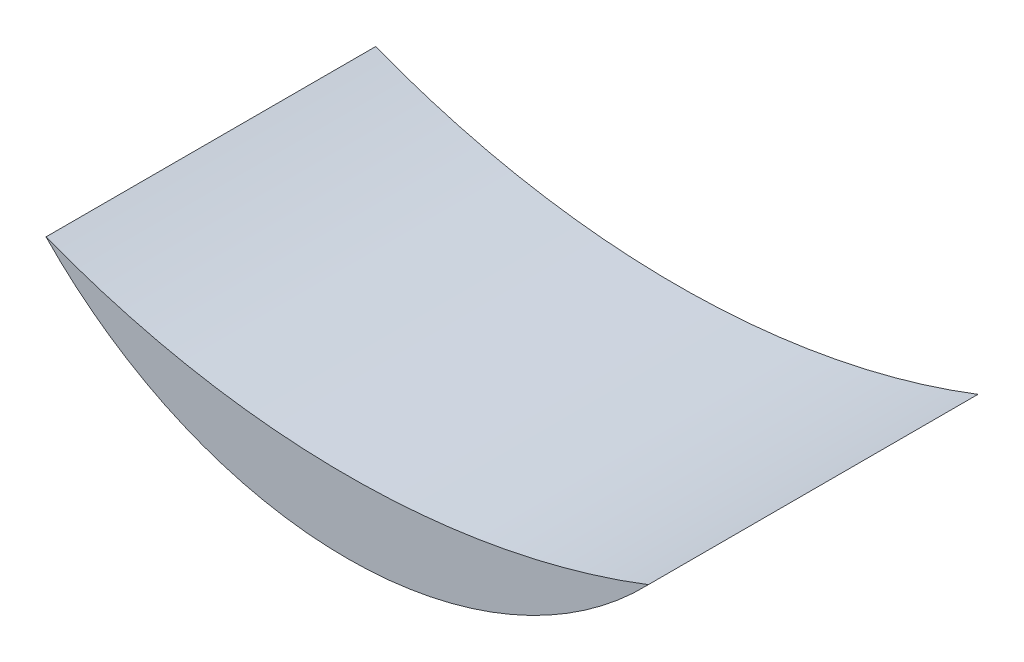
ISO-10303-21;
HEADER;
FILE_DESCRIPTION(('STEP AP214'),'2;1');
FILE_NAME('part.step','',(''),(''),'','','');
FILE_SCHEMA(('AUTOMOTIVE_DESIGN { 1 0 10303 214 1 1 1 1 }'));
ENDSEC;
DATA;
#1=APPLICATION_CONTEXT('core data for automotive mechanical design processes');
#2=APPLICATION_PROTOCOL_DEFINITION('international standard','automotive_design',2000,#1);
#3=PRODUCT_CONTEXT('',#1,'mechanical');
#4=PRODUCT('Part','Part','',(#3));
#5=PRODUCT_RELATED_PRODUCT_CATEGORY('part','',(#4));
#6=PRODUCT_DEFINITION_FORMATION('','',#4);
#7=PRODUCT_DEFINITION_CONTEXT('part definition',#1,'design');
#8=PRODUCT_DEFINITION('design','',#6,#7);
#9=PRODUCT_DEFINITION_SHAPE('','',#8);
#10=(LENGTH_UNIT() NAMED_UNIT(*) SI_UNIT(.MILLI.,.METRE.));
#11=(NAMED_UNIT(*) PLANE_ANGLE_UNIT() SI_UNIT($,.RADIAN.));
#12=(NAMED_UNIT(*) SI_UNIT($,.STERADIAN.) SOLID_ANGLE_UNIT());
#13=UNCERTAINTY_MEASURE_WITH_UNIT(LENGTH_MEASURE(1.E-05),#10,'distance_accuracy_value','');
#14=(GEOMETRIC_REPRESENTATION_CONTEXT(3) GLOBAL_UNCERTAINTY_ASSIGNED_CONTEXT((#13)) GLOBAL_UNIT_ASSIGNED_CONTEXT((#10,
#11,#12)) REPRESENTATION_CONTEXT('',''));
#15=CARTESIAN_POINT('',(0.,0.,0.));
#16=DIRECTION('',(0.,0.,1.));
#17=DIRECTION('',(1.,0.,0.));
#18=AXIS2_PLACEMENT_3D('',#15,#16,#17);
#19=CARTESIAN_POINT('',(96.647,117.983,0.));
#20=DIRECTION('',(0.,0.,-1.));
#21=DIRECTION('',(1.,0.,0.));
#22=AXIS2_PLACEMENT_3D('',#19,#20,#21);
#23=CYLINDRICAL_SURFACE('',#22,0.508);
#24=DIRECTION('',(0.,0.,1.));
#25=VECTOR('',#24,1.);
#26=CARTESIAN_POINT('',(96.4642567729009,117.509007475851,0.));
#27=LINE('',#26,#25);
#28=CARTESIAN_POINT('',(96.4642567729009,117.509007475851,0.));
#29=VERTEX_POINT('',#28);
#30=CARTESIAN_POINT('',(96.4642567729009,117.509007475851,0.1999996));
#31=VERTEX_POINT('',#30);
#32=EDGE_CURVE('E11',#29,#31,#27,.T.);
#33=ORIENTED_EDGE('',*,*,#32,.T.);
#34=CARTESIAN_POINT('',(96.647,117.983,0.1999996));
#35=DIRECTION('',(0.,0.,1.));
#36=DIRECTION('',(1.,0.,0.));
#37=AXIS2_PLACEMENT_3D('',#34,#35,#36);
#38=CIRCLE('',#37,0.508);
#39=CARTESIAN_POINT('',(96.8297432270991,117.509007475851,0.1999996));
#40=VERTEX_POINT('',#39);
#41=EDGE_CURVE('E24',#31,#40,#38,.T.);
#42=ORIENTED_EDGE('',*,*,#41,.T.);
#43=DIRECTION('',(0.,0.,1.));
#44=VECTOR('',#43,1.);
#45=CARTESIAN_POINT('',(96.8297432270991,117.509007475851,0.));
#46=LINE('',#45,#44);
#47=CARTESIAN_POINT('',(96.8297432270991,117.509007475851,0.));
#48=VERTEX_POINT('',#47);
#49=EDGE_CURVE('E40',#48,#40,#46,.T.);
#50=ORIENTED_EDGE('',*,*,#49,.F.);
#51=CARTESIAN_POINT('',(96.647,117.983,0.));
#52=DIRECTION('',(0.,0.,1.));
#53=DIRECTION('',(1.,0.,0.));
#54=AXIS2_PLACEMENT_3D('',#51,#52,#53);
#55=CIRCLE('',#54,0.508);
#56=EDGE_CURVE('E42',#29,#48,#55,.T.);
#57=ORIENTED_EDGE('',*,*,#56,.F.);
#58=EDGE_LOOP('',(#33,#42,#50,#57));
#59=FACE_BOUND('',#58,.T.);
#60=ADVANCED_FACE('F17',(#59),#23,.F.);
#61=CARTESIAN_POINT('',(96.647,117.68541868,0.));
#62=DIRECTION('',(0.,0.,-1.));
#63=DIRECTION('',(-1.,0.,0.));
#64=AXIS2_PLACEMENT_3D('',#61,#62,#63);
#65=CYLINDRICAL_SURFACE('',#64,0.253999999999995);
#66=CARTESIAN_POINT('',(96.647,117.68541868,0.1999996));
#67=DIRECTION('',(0.,0.,1.));
#68=DIRECTION('',(-1.,0.,0.));
#69=AXIS2_PLACEMENT_3D('',#66,#67,#68);
#70=CIRCLE('',#69,0.253999999999995);
#71=EDGE_CURVE('E49',#31,#40,#70,.T.);
#72=ORIENTED_EDGE('',*,*,#71,.F.);
#73=ORIENTED_EDGE('',*,*,#32,.F.);
#74=CARTESIAN_POINT('',(96.647,117.68541868,0.));
#75=DIRECTION('',(0.,0.,1.));
#76=DIRECTION('',(-1.,0.,0.));
#77=AXIS2_PLACEMENT_3D('',#74,#75,#76);
#78=CIRCLE('',#77,0.253999999999995);
#79=EDGE_CURVE('E48',#29,#48,#78,.T.);
#80=ORIENTED_EDGE('',*,*,#79,.T.);
#81=ORIENTED_EDGE('',*,*,#49,.T.);
#82=EDGE_LOOP('',(#72,#73,#80,#81));
#83=FACE_BOUND('',#82,.T.);
#84=ADVANCED_FACE('F51',(#83),#65,.T.);
#85=CARTESIAN_POINT('',(96.901,117.68541868,0.));
#86=DIRECTION('',(0.,0.,-1.));
#87=DIRECTION('',(-1.,0.,0.));
#88=AXIS2_PLACEMENT_3D('',#85,#86,#87);
#89=PLANE('',#88);
#90=ORIENTED_EDGE('',*,*,#56,.T.);
#91=ORIENTED_EDGE('',*,*,#79,.F.);
#92=EDGE_LOOP('',(#90,#91));
#93=FACE_BOUND('',#92,.T.);
#94=ADVANCED_FACE('F47',(#93),#89,.T.);
#95=CARTESIAN_POINT('',(96.901,117.68541868,0.1999996));
#96=DIRECTION('',(0.,0.,-1.));
#97=DIRECTION('',(-1.,0.,0.));
#98=AXIS2_PLACEMENT_3D('',#95,#96,#97);
#99=PLANE('',#98);
#100=ORIENTED_EDGE('',*,*,#71,.T.);
#101=ORIENTED_EDGE('',*,*,#41,.F.);
#102=EDGE_LOOP('',(#100,#101));
#103=FACE_BOUND('',#102,.T.);
#104=ADVANCED_FACE('F55',(#103),#99,.F.);
#105=CLOSED_SHELL('',(#60,#84,#94,#104));
#106=MANIFOLD_SOLID_BREP('B1',#105);
#107=ADVANCED_BREP_SHAPE_REPRESENTATION('',(#18,#106),#14);
#108=SHAPE_DEFINITION_REPRESENTATION(#9,#107);
ENDSEC;
END-ISO-10303-21;
